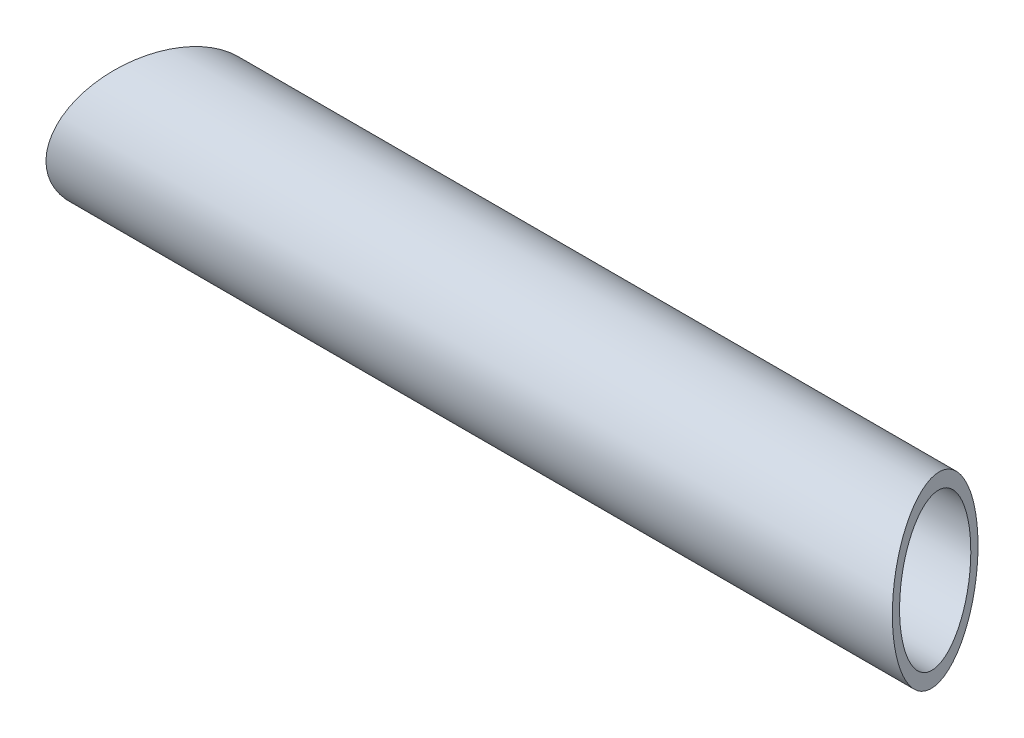
ISO-10303-21;
HEADER;
FILE_DESCRIPTION(('STEP AP214'),'2;1');
FILE_NAME('part.step','',(''),(''),'','','');
FILE_SCHEMA(('AUTOMOTIVE_DESIGN { 1 0 10303 214 1 1 1 1 }'));
ENDSEC;
DATA;
#1=APPLICATION_CONTEXT('core data for automotive mechanical design processes');
#2=APPLICATION_PROTOCOL_DEFINITION('international standard','automotive_design',2000,#1);
#3=PRODUCT_CONTEXT('',#1,'mechanical');
#4=PRODUCT('Part','Part','',(#3));
#5=PRODUCT_RELATED_PRODUCT_CATEGORY('part','',(#4));
#6=PRODUCT_DEFINITION_FORMATION('','',#4);
#7=PRODUCT_DEFINITION_CONTEXT('part definition',#1,'design');
#8=PRODUCT_DEFINITION('design','',#6,#7);
#9=PRODUCT_DEFINITION_SHAPE('','',#8);
#10=(LENGTH_UNIT() NAMED_UNIT(*) SI_UNIT(.MILLI.,.METRE.));
#11=(NAMED_UNIT(*) PLANE_ANGLE_UNIT() SI_UNIT($,.RADIAN.));
#12=(NAMED_UNIT(*) SI_UNIT($,.STERADIAN.) SOLID_ANGLE_UNIT());
#13=UNCERTAINTY_MEASURE_WITH_UNIT(LENGTH_MEASURE(1.E-05),#10,'distance_accuracy_value','');
#14=(GEOMETRIC_REPRESENTATION_CONTEXT(3) GLOBAL_UNCERTAINTY_ASSIGNED_CONTEXT((#13)) GLOBAL_UNIT_ASSIGNED_CONTEXT((#10,
#11,#12)) REPRESENTATION_CONTEXT('',''));
#15=CARTESIAN_POINT('',(0.,0.,0.));
#16=DIRECTION('',(0.,0.,1.));
#17=DIRECTION('',(1.,0.,0.));
#18=AXIS2_PLACEMENT_3D('',#15,#16,#17);
#19=CARTESIAN_POINT('',(-50.,130.,0.));
#20=DIRECTION('',(1.,0.,0.));
#21=DIRECTION('',(0.,1.,0.));
#22=AXIS2_PLACEMENT_3D('',#19,#20,#21);
#23=CYLINDRICAL_SURFACE('',#22,7.9);
#24=CARTESIAN_POINT('',(-50.,130.,0.));
#25=DIRECTION('',(-0.904650427063292,0.140780299510551,-0.402229427173004));
#26=DIRECTION('',(0.426154437750217,0.298851652810821,-0.853861865173774));
#27=AXIS2_PLACEMENT_3D('',#24,#25,#26);
#28=ELLIPSE('',#27,8.73265491693323,7.9);
#29=CARTESIAN_POINT('',(-46.2785403538077,132.609768355352,-7.45648101529144));
#30=VERTEX_POINT('',#29);
#31=EDGE_CURVE('E53',#30,#30,#28,.T.);
#32=ORIENTED_EDGE('',*,*,#31,.T.);
#33=EDGE_LOOP('',(#32));
#34=FACE_BOUND('',#33,.T.);
#35=CARTESIAN_POINT('',(50.,130.,0.));
#36=DIRECTION('',(0.904650427063292,0.140780299510552,-0.402229427173004));
#37=DIRECTION('',(0.426154437750217,-0.298851652810821,0.853861865173774));
#38=AXIS2_PLACEMENT_3D('',#35,#36,#37);
#39=ELLIPSE('',#38,8.73265491693323,7.9);
#40=CARTESIAN_POINT('',(53.7214596461924,127.390231644648,7.45648101529163));
#41=VERTEX_POINT('',#40);
#42=EDGE_CURVE('E43',#41,#41,#39,.T.);
#43=ORIENTED_EDGE('',*,*,#42,.T.);
#44=EDGE_LOOP('',(#43));
#45=FACE_BOUND('',#44,.T.);
#46=ADVANCED_FACE('F39',(#34,#45),#23,.F.);
#47=CARTESIAN_POINT('',(-50.,130.,0.));
#48=DIRECTION('',(1.,0.,0.));
#49=DIRECTION('',(0.,1.,0.));
#50=AXIS2_PLACEMENT_3D('',#47,#48,#49);
#51=CYLINDRICAL_SURFACE('',#50,9.5);
#52=CARTESIAN_POINT('',(-50.,130.,0.));
#53=DIRECTION('',(-0.904650427063292,0.140780299510551,-0.402229427173004));
#54=DIRECTION('',(0.426154437750217,0.298851652810821,-0.853861865173774));
#55=AXIS2_PLACEMENT_3D('',#52,#53,#54);
#56=ELLIPSE('',#55,10.5012938874513,9.5);
#57=CARTESIAN_POINT('',(-45.5248270077434,133.138329034917,-8.96665438547706));
#58=VERTEX_POINT('',#57);
#59=EDGE_CURVE('E47',#58,#58,#56,.T.);
#60=ORIENTED_EDGE('',*,*,#59,.F.);
#61=EDGE_LOOP('',(#60));
#62=FACE_BOUND('',#61,.T.);
#63=CARTESIAN_POINT('',(50.,130.,0.));
#64=DIRECTION('',(0.904650427063292,0.140780299510552,-0.402229427173004));
#65=DIRECTION('',(0.426154437750217,-0.298851652810821,0.853861865173774));
#66=AXIS2_PLACEMENT_3D('',#63,#64,#65);
#67=ELLIPSE('',#66,10.5012938874513,9.5);
#68=CARTESIAN_POINT('',(54.4751729922567,126.861670965083,8.96665438547725));
#69=VERTEX_POINT('',#68);
#70=EDGE_CURVE('E10',#69,#69,#67,.T.);
#71=ORIENTED_EDGE('',*,*,#70,.F.);
#72=EDGE_LOOP('',(#71));
#73=FACE_BOUND('',#72,.T.);
#74=ADVANCED_FACE('F67',(#62,#73),#51,.T.);
#75=CARTESIAN_POINT('',(-50.,130.,0.));
#76=DIRECTION('',(-0.904650427063292,0.140780299510551,-0.402229427173004));
#77=DIRECTION('',(-0.406275581998161,0.,0.913750595880548));
#78=AXIS2_PLACEMENT_3D('',#75,#76,#77);
#79=PLANE('',#78);
#80=ORIENTED_EDGE('',*,*,#31,.F.);
#81=EDGE_LOOP('',(#80));
#82=FACE_BOUND('',#81,.T.);
#83=ORIENTED_EDGE('',*,*,#59,.T.);
#84=EDGE_LOOP('',(#83));
#85=FACE_BOUND('',#84,.T.);
#86=ADVANCED_FACE('F62',(#82,#85),#79,.T.);
#87=CARTESIAN_POINT('',(50.,130.,0.));
#88=DIRECTION('',(0.904650427063292,0.140780299510552,-0.402229427173004));
#89=DIRECTION('',(-0.406275581998161,0.,-0.913750595880547));
#90=AXIS2_PLACEMENT_3D('',#87,#88,#89);
#91=PLANE('',#90);
#92=ORIENTED_EDGE('',*,*,#42,.F.);
#93=EDGE_LOOP('',(#92));
#94=FACE_BOUND('',#93,.T.);
#95=ORIENTED_EDGE('',*,*,#70,.T.);
#96=EDGE_LOOP('',(#95));
#97=FACE_BOUND('',#96,.T.);
#98=ADVANCED_FACE('F41',(#94,#97),#91,.T.);
#99=CLOSED_SHELL('',(#46,#74,#86,#98));
#100=MANIFOLD_SOLID_BREP('B2',#99);
#101=ADVANCED_BREP_SHAPE_REPRESENTATION('',(#18,#100),#14);
#102=SHAPE_DEFINITION_REPRESENTATION(#9,#101);
ENDSEC;
END-ISO-10303-21;
